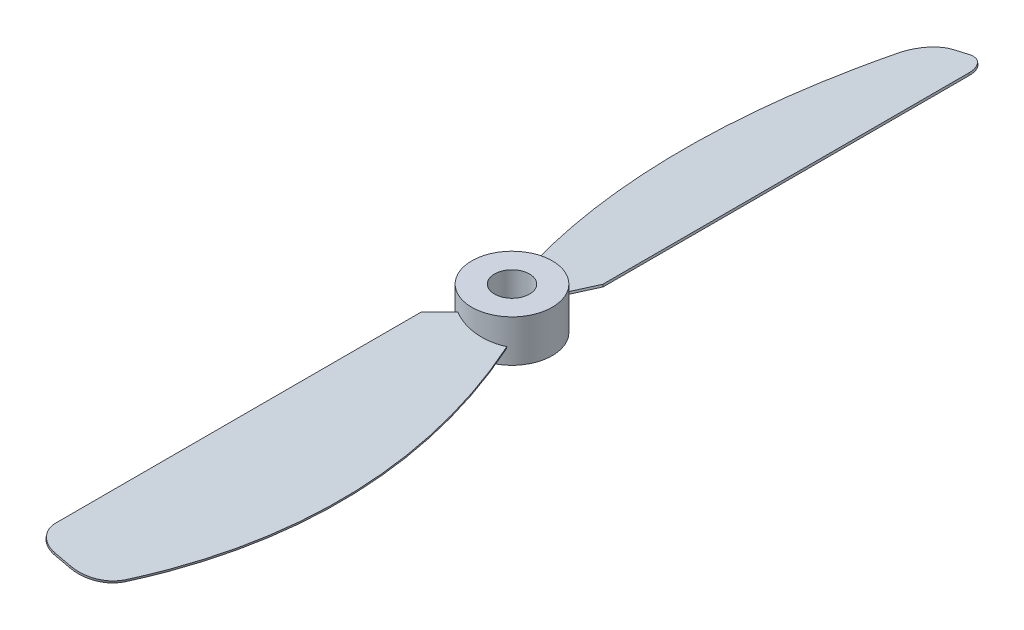
ISO-10303-21;
HEADER;
FILE_DESCRIPTION(('STEP AP214'),'2;1');
FILE_NAME('part.step','',(''),(''),'','','');
FILE_SCHEMA(('AUTOMOTIVE_DESIGN { 1 0 10303 214 1 1 1 1 }'));
ENDSEC;
DATA;
#1=APPLICATION_CONTEXT('core data for automotive mechanical design processes');
#2=APPLICATION_PROTOCOL_DEFINITION('international standard','automotive_design',2000,#1);
#3=PRODUCT_CONTEXT('',#1,'mechanical');
#4=PRODUCT('Part','Part','',(#3));
#5=PRODUCT_RELATED_PRODUCT_CATEGORY('part','',(#4));
#6=PRODUCT_DEFINITION_FORMATION('','',#4);
#7=PRODUCT_DEFINITION_CONTEXT('part definition',#1,'design');
#8=PRODUCT_DEFINITION('design','',#6,#7);
#9=PRODUCT_DEFINITION_SHAPE('','',#8);
#10=(LENGTH_UNIT() NAMED_UNIT(*) SI_UNIT(.MILLI.,.METRE.));
#11=(NAMED_UNIT(*) PLANE_ANGLE_UNIT() SI_UNIT($,.RADIAN.));
#12=(NAMED_UNIT(*) SI_UNIT($,.STERADIAN.) SOLID_ANGLE_UNIT());
#13=UNCERTAINTY_MEASURE_WITH_UNIT(LENGTH_MEASURE(1.E-05),#10,'distance_accuracy_value','');
#14=(GEOMETRIC_REPRESENTATION_CONTEXT(3) GLOBAL_UNCERTAINTY_ASSIGNED_CONTEXT((#13)) GLOBAL_UNIT_ASSIGNED_CONTEXT((#10,
#11,#12)) REPRESENTATION_CONTEXT('',''));
#15=CARTESIAN_POINT('',(0.,0.,0.));
#16=DIRECTION('',(0.,0.,1.));
#17=DIRECTION('',(1.,0.,0.));
#18=AXIS2_PLACEMENT_3D('',#15,#16,#17);
#19=CARTESIAN_POINT('',(0.,3.,0.));
#20=DIRECTION('',(0.,-1.,0.));
#21=DIRECTION('',(0.,0.,-1.));
#22=AXIS2_PLACEMENT_3D('',#19,#20,#21);
#23=CYLINDRICAL_SURFACE('',#22,5.75);
#24=CARTESIAN_POINT('',(0.,-0.153945616169009,0.));
#25=DIRECTION('',(0.224951054343865,0.974370064785235,0.));
#26=DIRECTION('',(0.974370064785235,-0.224951054343865,0.));
#27=AXIS2_PLACEMENT_3D('',#24,#25,#26);
#28=ELLIPSE('',#27,5.901248619812,5.75);
#29=CARTESIAN_POINT('',(-2.69442240653645,0.468110810956249,5.07962477897279));
#30=VERTEX_POINT('',#29);
#31=CARTESIAN_POINT('',(3.63251218425725,-0.992577133390051,4.45728114787732));
#32=VERTEX_POINT('',#31);
#33=EDGE_CURVE('E356',#30,#32,#28,.T.);
#34=ORIENTED_EDGE('',*,*,#33,.F.);
#35=CARTESIAN_POINT('',(0.,-3.75067615816323,0.));
#36=DIRECTION('',(0.796858324367415,-0.183969239930053,0.575475568244139));
#37=DIRECTION('',(-0.149142992703251,-0.982932001086321,-0.107708165744104));
#38=AXIS2_PLACEMENT_3D('',#35,#36,#37);
#39=ELLIPSE('',#38,31.2552250701597,5.75);
#40=CARTESIAN_POINT('',(-2.64477953075084,0.764541082359371,5.10564797393253));
#41=VERTEX_POINT('',#40);
#42=EDGE_CURVE('E229',#41,#30,#39,.T.);
#43=ORIENTED_EDGE('',*,*,#42,.F.);
#44=CARTESIAN_POINT('',(0.,0.153945616169009,0.));
#45=DIRECTION('',(0.224951054343865,0.974370064785235,0.));
#46=DIRECTION('',(0.974370064785235,-0.224951054343865,0.));
#47=AXIS2_PLACEMENT_3D('',#44,#45,#46);
#48=ELLIPSE('',#47,5.901248619812,5.75);
#49=CARTESIAN_POINT('',(3.6832769696305,-0.696405875224031,4.4154241885678));
#50=VERTEX_POINT('',#49);
#51=EDGE_CURVE('E230',#41,#50,#48,.T.);
#52=ORIENTED_EDGE('',*,*,#51,.T.);
#53=CARTESIAN_POINT('',(3.63251218425725,-0.99257713339005,4.45728114787732));
#54=CARTESIAN_POINT('',(3.64100067971846,-0.943211739786049,4.45036346773442));
#55=CARTESIAN_POINT('',(3.64947532623017,-0.893848104803546,4.44341654772051));
#56=CARTESIAN_POINT('',(3.66639692135458,-0.795124352081539,4.42946422795067));
#57=CARTESIAN_POINT('',(3.67484386996729,-0.745764234342035,4.42245882819474));
#58=CARTESIAN_POINT('',(3.68327696963049,-0.696405875224031,4.4154241885678));
#59=B_SPLINE_CURVE_WITH_KNOTS('',3,(#53,#54,#55,#56,#57,#58),.UNSPECIFIED.,.F.,.F.,(4,2,4),(0.,
0.15169584736826,0.303391694736519),.UNSPECIFIED.);
#60=EDGE_CURVE('E221',#32,#50,#59,.T.);
#61=ORIENTED_EDGE('',*,*,#60,.F.);
#62=EDGE_LOOP('',(#34,#43,#52,#61));
#63=FACE_BOUND('',#62,.T.);
#64=CARTESIAN_POINT('',(0.,3.,0.));
#65=DIRECTION('',(0.,1.,0.));
#66=DIRECTION('',(0.,0.,1.));
#67=AXIS2_PLACEMENT_3D('',#64,#65,#66);
#68=CIRCLE('',#67,5.75);
#69=CARTESIAN_POINT('',(0.,3.,5.75));
#70=VERTEX_POINT('',#69);
#71=EDGE_CURVE('E424',#70,#70,#68,.T.);
#72=ORIENTED_EDGE('',*,*,#71,.F.);
#73=EDGE_LOOP('',(#72));
#74=FACE_BOUND('',#73,.T.);
#75=CARTESIAN_POINT('',(0.,-3.,0.));
#76=DIRECTION('',(0.,1.,0.));
#77=DIRECTION('',(0.,0.,1.));
#78=AXIS2_PLACEMENT_3D('',#75,#76,#77);
#79=CIRCLE('',#78,5.75);
#80=CARTESIAN_POINT('',(0.,-3.,5.75));
#81=VERTEX_POINT('',#80);
#82=EDGE_CURVE('E423',#81,#81,#79,.T.);
#83=ORIENTED_EDGE('',*,*,#82,.T.);
#84=EDGE_LOOP('',(#83));
#85=FACE_BOUND('',#84,.T.);
#86=CARTESIAN_POINT('',(0.,-0.153945616169009,0.));
#87=DIRECTION('',(-0.224951054343865,0.974370064785235,0.));
#88=DIRECTION('',(-0.974370064785235,-0.224951054343865,0.));
#89=AXIS2_PLACEMENT_3D('',#86,#87,#88);
#90=ELLIPSE('',#89,5.901248619812,5.75);
#91=CARTESIAN_POINT('',(2.69442240653645,0.468110810956249,-5.07962477897279));
#92=VERTEX_POINT('',#91);
#93=CARTESIAN_POINT('',(-3.63251218425725,-0.992577133390051,-4.45728114787732));
#94=VERTEX_POINT('',#93);
#95=EDGE_CURVE('E345',#92,#94,#90,.T.);
#96=ORIENTED_EDGE('',*,*,#95,.F.);
#97=CARTESIAN_POINT('',(0.,-3.75067615816323,0.));
#98=DIRECTION('',(-0.796858324367415,-0.183969239930053,-0.575475568244139));
#99=DIRECTION('',(0.149142992703251,-0.982932001086321,0.107708165744104));
#100=AXIS2_PLACEMENT_3D('',#97,#98,#99);
#101=ELLIPSE('',#100,31.2552250701597,5.75);
#102=CARTESIAN_POINT('',(2.64477953075084,0.764541082359371,-5.10564797393253));
#103=VERTEX_POINT('',#102);
#104=EDGE_CURVE('E250',#103,#92,#101,.T.);
#105=ORIENTED_EDGE('',*,*,#104,.F.);
#106=CARTESIAN_POINT('',(0.,0.153945616169009,0.));
#107=DIRECTION('',(-0.224951054343865,0.974370064785235,0.));
#108=DIRECTION('',(-0.974370064785235,-0.224951054343865,0.));
#109=AXIS2_PLACEMENT_3D('',#106,#107,#108);
#110=ELLIPSE('',#109,5.901248619812,5.75);
#111=CARTESIAN_POINT('',(-3.6832769696305,-0.696405875224031,-4.4154241885678));
#112=VERTEX_POINT('',#111);
#113=EDGE_CURVE('E251',#103,#112,#110,.T.);
#114=ORIENTED_EDGE('',*,*,#113,.T.);
#115=CARTESIAN_POINT('',(-3.63251218425725,-0.99257713339005,-4.45728114787732));
#116=CARTESIAN_POINT('',(-3.64100067971846,-0.943211739786049,-4.45036346773442));
#117=CARTESIAN_POINT('',(-3.64947532623017,-0.893848104803546,-4.44341654772051));
#118=CARTESIAN_POINT('',(-3.66639692135458,-0.795124352081539,-4.42946422795067));
#119=CARTESIAN_POINT('',(-3.67484386996729,-0.745764234342035,-4.42245882819474));
#120=CARTESIAN_POINT('',(-3.68327696963049,-0.696405875224031,-4.4154241885678));
#121=B_SPLINE_CURVE_WITH_KNOTS('',3,(#115,#116,#117,#118,#119,#120),.UNSPECIFIED.,.F.,.F.,(4,2,
4),(0.,0.15169584736826,0.303391694736519),.UNSPECIFIED.);
#122=EDGE_CURVE('E241',#94,#112,#121,.T.);
#123=ORIENTED_EDGE('',*,*,#122,.F.);
#124=EDGE_LOOP('',(#96,#105,#114,#123));
#125=FACE_BOUND('',#124,.T.);
#126=ADVANCED_FACE('F41',(#63,#74,#85,#125),#23,.T.);
#127=CARTESIAN_POINT('',(0.,3.,0.));
#128=DIRECTION('',(0.,1.,0.));
#129=DIRECTION('',(0.,0.,1.));
#130=AXIS2_PLACEMENT_3D('',#127,#128,#129);
#131=PLANE('',#130);
#132=CARTESIAN_POINT('',(0.,3.,0.));
#133=DIRECTION('',(0.,-1.,0.));
#134=DIRECTION('',(0.,0.,-1.));
#135=AXIS2_PLACEMENT_3D('',#132,#133,#134);
#136=CIRCLE('',#135,2.5);
#137=CARTESIAN_POINT('',(0.,3.,-2.5));
#138=VERTEX_POINT('',#137);
#139=EDGE_CURVE('E284',#138,#138,#136,.T.);
#140=ORIENTED_EDGE('',*,*,#139,.T.);
#141=EDGE_LOOP('',(#140));
#142=FACE_BOUND('',#141,.T.);
#143=ORIENTED_EDGE('',*,*,#71,.T.);
#144=EDGE_LOOP('',(#143));
#145=FACE_BOUND('',#144,.T.);
#146=ADVANCED_FACE('F236',(#142,#145),#131,.T.);
#147=CARTESIAN_POINT('',(0.,-3.,0.));
#148=DIRECTION('',(0.,1.,0.));
#149=DIRECTION('',(0.,0.,1.));
#150=AXIS2_PLACEMENT_3D('',#147,#148,#149);
#151=PLANE('',#150);
#152=CARTESIAN_POINT('',(0.,-3.,0.));
#153=DIRECTION('',(0.,1.,0.));
#154=DIRECTION('',(0.,0.,1.));
#155=AXIS2_PLACEMENT_3D('',#152,#153,#154);
#156=CIRCLE('',#155,3.49999999999999);
#157=CARTESIAN_POINT('',(0.,-3.,3.49999999999999));
#158=VERTEX_POINT('',#157);
#159=EDGE_CURVE('E11',#158,#158,#156,.T.);
#160=ORIENTED_EDGE('',*,*,#159,.T.);
#161=EDGE_LOOP('',(#160));
#162=FACE_BOUND('',#161,.T.);
#163=ORIENTED_EDGE('',*,*,#82,.F.);
#164=EDGE_LOOP('',(#163));
#165=FACE_BOUND('',#164,.T.);
#166=ADVANCED_FACE('F214',(#162,#165),#151,.F.);
#167=CARTESIAN_POINT('',(3.52087999817165,-0.966804812517074,4.17905065683717));
#168=CARTESIAN_POINT('',(10.9244745701346,-2.67605929917321,22.5371504524782));
#169=CARTESIAN_POINT('',(11.2274533946563,-2.74600747233987,41.9175654933242));
#170=CARTESIAN_POINT('',(4.93508001000345,-1.29329861113843,60.1679103138587));
#171=B_SPLINE_CURVE_WITH_KNOTS('',3,(#167,#168,#169,#170),.UNSPECIFIED.,.F.,.F.,(4,4),(0.,
0.942591792092001),.UNSPECIFIED.);
#172=DIRECTION('',(0.224951054343865,0.974370064785235,0.));
#173=VECTOR('',#172,1.);
#174=SURFACE_OF_LINEAR_EXTRUSION('',#171,#173);
#175=CARTESIAN_POINT('',(4.93508001000345,-1.29329861113843,60.1679103138587));
#176=VERTEX_POINT('',#175);
#177=EDGE_CURVE('E196',#32,#176,#171,.T.);
#178=ORIENTED_EDGE('',*,*,#177,.F.);
#179=ORIENTED_EDGE('',*,*,#60,.T.);
#180=CARTESIAN_POINT('',(3.58836531447481,-0.674493793081504,4.17905065683717));
#181=CARTESIAN_POINT('',(10.9919598864378,-2.38374827973764,22.5371504524782));
#182=CARTESIAN_POINT('',(11.2949387109594,-2.4536964529043,41.9175654933242));
#183=CARTESIAN_POINT('',(5.00256532630661,-1.00098759170286,60.1679103138587));
#184=B_SPLINE_CURVE_WITH_KNOTS('',3,(#180,#181,#182,#183),.UNSPECIFIED.,.F.,.F.,(4,4),(0.,
0.942591792092001),.UNSPECIFIED.);
#185=CARTESIAN_POINT('',(5.00256532630661,-1.00098759170286,60.1679103138587));
#186=VERTEX_POINT('',#185);
#187=EDGE_CURVE('E66',#50,#186,#184,.T.);
#188=ORIENTED_EDGE('',*,*,#187,.T.);
#189=DIRECTION('',(0.224951054343865,0.974370064785235,0.));
#190=VECTOR('',#189,1.);
#191=CARTESIAN_POINT('',(4.93508001000345,-1.29329861113843,60.1679103138587));
#192=LINE('',#191,#190);
#193=EDGE_CURVE('E376',#176,#186,#192,.T.);
#194=ORIENTED_EDGE('',*,*,#193,.F.);
#195=EDGE_LOOP('',(#178,#179,#188,#194));
#196=FACE_BOUND('',#195,.T.);
#197=ADVANCED_FACE('F208',(#196),#174,.F.);
#198=CARTESIAN_POINT('',(-1.91210862672236,0.287499443717968,60.5));
#199=DIRECTION('',(0.224951054343865,0.974370064785235,0.));
#200=DIRECTION('',(-0.974370064785235,0.224951054343865,0.));
#201=AXIS2_PLACEMENT_3D('',#198,#199,#200);
#202=CYLINDRICAL_SURFACE('',#201,3.);
#203=CARTESIAN_POINT('',(-1.8446233104192,0.579810463153539,60.5));
#204=DIRECTION('',(-0.224951054343865,-0.974370064785235,0.));
#205=DIRECTION('',(-0.974370064785235,0.224951054343865,0.));
#206=AXIS2_PLACEMENT_3D('',#203,#204,#205);
#207=CIRCLE('',#206,3.);
#208=CARTESIAN_POINT('',(-1.84462331041918,0.579810463153534,63.5));
#209=VERTEX_POINT('',#208);
#210=CARTESIAN_POINT('',(-4.76773350477491,1.25466362618513,60.5));
#211=VERTEX_POINT('',#210);
#212=EDGE_CURVE('E173',#209,#211,#207,.T.);
#213=ORIENTED_EDGE('',*,*,#212,.T.);
#214=DIRECTION('',(0.224951054343865,0.974370064785235,0.));
#215=VECTOR('',#214,1.);
#216=CARTESIAN_POINT('',(-4.83521882107807,0.962352606749564,60.5));
#217=LINE('',#216,#215);
#218=CARTESIAN_POINT('',(-4.83521882107807,0.962352606749564,60.5));
#219=VERTEX_POINT('',#218);
#220=EDGE_CURVE('E419',#219,#211,#217,.T.);
#221=ORIENTED_EDGE('',*,*,#220,.F.);
#222=CARTESIAN_POINT('',(-1.91210862672236,0.287499443717968,60.5));
#223=DIRECTION('',(-0.224951054343865,-0.974370064785235,0.));
#224=DIRECTION('',(-0.974370064785235,0.224951054343865,0.));
#225=AXIS2_PLACEMENT_3D('',#222,#223,#224);
#226=CIRCLE('',#225,3.);
#227=CARTESIAN_POINT('',(-1.91210862672234,0.287499443717963,63.5));
#228=VERTEX_POINT('',#227);
#229=EDGE_CURVE('E184',#228,#219,#226,.T.);
#230=ORIENTED_EDGE('',*,*,#229,.F.);
#231=DIRECTION('',(0.224951054343865,0.974370064785235,0.));
#232=VECTOR('',#231,1.);
#233=CARTESIAN_POINT('',(-1.91210862672234,0.287499443717963,63.5));
#234=LINE('',#233,#232);
#235=EDGE_CURVE('E390',#228,#209,#234,.T.);
#236=ORIENTED_EDGE('',*,*,#235,.T.);
#237=EDGE_LOOP('',(#213,#221,#230,#236));
#238=FACE_BOUND('',#237,.T.);
#239=ADVANCED_FACE('F213',(#238),#202,.T.);
#240=CARTESIAN_POINT('',(-4.83521882107807,0.962352606749564,8.20197580544569));
#241=DIRECTION('',(0.974370064785235,-0.224951054343865,0.));
#242=DIRECTION('',(0.224951054343865,0.974370064785235,0.));
#243=AXIS2_PLACEMENT_3D('',#240,#241,#242);
#244=PLANE('',#243);
#245=DIRECTION('',(0.,0.,-1.));
#246=VECTOR('',#245,1.);
#247=CARTESIAN_POINT('',(-4.76773350477491,1.25466362618513,8.20197580544569));
#248=LINE('',#247,#246);
#249=CARTESIAN_POINT('',(-4.76773350477491,1.25466362618513,8.20197580544569));
#250=VERTEX_POINT('',#249);
#251=EDGE_CURVE('E178',#211,#250,#248,.T.);
#252=ORIENTED_EDGE('',*,*,#251,.T.);
#253=DIRECTION('',(0.224951054343865,0.974370064785235,0.));
#254=VECTOR('',#253,1.);
#255=CARTESIAN_POINT('',(-4.83521882107807,0.962352606749564,8.20197580544569));
#256=LINE('',#255,#254);
#257=CARTESIAN_POINT('',(-4.83521882107807,0.962352606749564,8.20197580544569));
#258=VERTEX_POINT('',#257);
#259=EDGE_CURVE('E416',#258,#250,#256,.T.);
#260=ORIENTED_EDGE('',*,*,#259,.F.);
#261=DIRECTION('',(0.,0.,-1.));
#262=VECTOR('',#261,1.);
#263=CARTESIAN_POINT('',(-4.83521882107807,0.962352606749564,8.20197580544569));
#264=LINE('',#263,#262);
#265=EDGE_CURVE('E188',#219,#258,#264,.T.);
#266=ORIENTED_EDGE('',*,*,#265,.F.);
#267=ORIENTED_EDGE('',*,*,#220,.T.);
#268=EDGE_LOOP('',(#252,#260,#266,#267));
#269=FACE_BOUND('',#268,.T.);
#270=ADVANCED_FACE('F444',(#269),#244,.F.);
#271=CARTESIAN_POINT('',(-2.07695632557669,0.32555753376368,4.17905065683717));
#272=DIRECTION('',(0.796858324367415,-0.183969239930053,0.575475568244139));
#273=DIRECTION('',(0.585468341256702,0.,-0.810695270361266));
#274=AXIS2_PLACEMENT_3D('',#271,#272,#273);
#275=PLANE('',#274);
#276=DIRECTION('',(0.560726166712362,-0.129453835825654,-0.817818971627637));
#277=VECTOR('',#276,1.);
#278=CARTESIAN_POINT('',(-2.00947100927353,0.61786855319925,4.17905065683717));
#279=LINE('',#278,#277);
#280=EDGE_CURVE('E368',#250,#41,#279,.T.);
#281=ORIENTED_EDGE('',*,*,#280,.T.);
#282=ORIENTED_EDGE('',*,*,#42,.T.);
#283=DIRECTION('',(0.560726166712362,-0.129453835825654,-0.817818971627637));
#284=VECTOR('',#283,1.);
#285=CARTESIAN_POINT('',(-2.07695632557669,0.32555753376368,4.17905065683717));
#286=LINE('',#285,#284);
#287=EDGE_CURVE('E192',#258,#30,#286,.T.);
#288=ORIENTED_EDGE('',*,*,#287,.F.);
#289=ORIENTED_EDGE('',*,*,#259,.T.);
#290=EDGE_LOOP('',(#281,#282,#288,#289));
#291=FACE_BOUND('',#290,.T.);
#292=ADVANCED_FACE('F218',(#291),#275,.F.);
#293=CARTESIAN_POINT('',(0.342284081521488,-0.23296812292095,58.5));
#294=DIRECTION('',(0.224951054343865,0.974370064785235,0.));
#295=DIRECTION('',(-0.974370064785235,0.224951054343865,0.));
#296=AXIS2_PLACEMENT_3D('',#293,#294,#295);
#297=CYLINDRICAL_SURFACE('',#296,4.99999999999998);
#298=CARTESIAN_POINT('',(0.409769397824648,0.0593428965146209,58.5));
#299=DIRECTION('',(-0.224951054343865,-0.974370064785235,0.));
#300=DIRECTION('',(-0.974370064785235,0.224951054343865,0.));
#301=AXIS2_PLACEMENT_3D('',#298,#299,#300);
#302=CIRCLE('',#301,4.99999999999998);
#303=CARTESIAN_POINT('',(0.40976939782462,0.0593428965146272,63.5));
#304=VERTEX_POINT('',#303);
#305=EDGE_CURVE('E386',#186,#304,#302,.T.);
#306=ORIENTED_EDGE('',*,*,#305,.T.);
#307=DIRECTION('',(0.224951054343865,0.974370064785235,0.));
#308=VECTOR('',#307,1.);
#309=CARTESIAN_POINT('',(0.342284081521461,-0.232968122920943,63.5));
#310=LINE('',#309,#308);
#311=CARTESIAN_POINT('',(0.342284081521461,-0.232968122920943,63.5));
#312=VERTEX_POINT('',#311);
#313=EDGE_CURVE('E385',#312,#304,#310,.T.);
#314=ORIENTED_EDGE('',*,*,#313,.F.);
#315=CARTESIAN_POINT('',(0.342284081521488,-0.23296812292095,58.5));
#316=DIRECTION('',(-0.224951054343865,-0.974370064785235,0.));
#317=DIRECTION('',(-0.974370064785235,0.224951054343865,0.));
#318=AXIS2_PLACEMENT_3D('',#315,#316,#317);
#319=CIRCLE('',#318,4.99999999999998);
#320=EDGE_CURVE('E202',#176,#312,#319,.T.);
#321=ORIENTED_EDGE('',*,*,#320,.F.);
#322=ORIENTED_EDGE('',*,*,#193,.T.);
#323=EDGE_LOOP('',(#306,#314,#321,#322));
#324=FACE_BOUND('',#323,.T.);
#325=ADVANCED_FACE('F216',(#324),#297,.T.);
#326=CARTESIAN_POINT('',(-1.91210862672234,0.287499443717963,63.5));
#327=DIRECTION('',(0.,0.,-1.));
#328=DIRECTION('',(-1.,0.,0.));
#329=AXIS2_PLACEMENT_3D('',#326,#327,#328);
#330=PLANE('',#329);
#331=DIRECTION('',(-0.974370064785235,0.224951054343865,0.));
#332=VECTOR('',#331,1.);
#333=CARTESIAN_POINT('',(-1.84462331041918,0.579810463153534,63.5));
#334=LINE('',#333,#332);
#335=EDGE_CURVE('E189',#304,#209,#334,.T.);
#336=ORIENTED_EDGE('',*,*,#335,.T.);
#337=ORIENTED_EDGE('',*,*,#235,.F.);
#338=DIRECTION('',(-0.974370064785235,0.224951054343865,0.));
#339=VECTOR('',#338,1.);
#340=CARTESIAN_POINT('',(-1.91210862672234,0.287499443717963,63.5));
#341=LINE('',#340,#339);
#342=EDGE_CURVE('E380',#312,#228,#341,.T.);
#343=ORIENTED_EDGE('',*,*,#342,.F.);
#344=ORIENTED_EDGE('',*,*,#313,.T.);
#345=EDGE_LOOP('',(#336,#337,#343,#344));
#346=FACE_BOUND('',#345,.T.);
#347=ADVANCED_FACE('F392',(#346),#330,.F.);
#348=CARTESIAN_POINT('',(-1.91210862672236,0.287499443717968,60.5));
#349=DIRECTION('',(0.224951054343865,0.974370064785235,0.));
#350=DIRECTION('',(-0.974370064785235,0.224951054343865,0.));
#351=AXIS2_PLACEMENT_3D('',#348,#349,#350);
#352=PLANE('',#351);
#353=ORIENTED_EDGE('',*,*,#287,.T.);
#354=ORIENTED_EDGE('',*,*,#33,.T.);
#355=ORIENTED_EDGE('',*,*,#177,.T.);
#356=ORIENTED_EDGE('',*,*,#320,.T.);
#357=ORIENTED_EDGE('',*,*,#342,.T.);
#358=ORIENTED_EDGE('',*,*,#229,.T.);
#359=ORIENTED_EDGE('',*,*,#265,.T.);
#360=EDGE_LOOP('',(#353,#354,#355,#356,#357,#358,#359));
#361=FACE_BOUND('',#360,.T.);
#362=ADVANCED_FACE('F370',(#361),#352,.F.);
#363=CARTESIAN_POINT('',(-1.8446233104192,0.579810463153539,60.5));
#364=DIRECTION('',(0.224951054343865,0.974370064785235,0.));
#365=DIRECTION('',(-0.974370064785235,0.224951054343865,0.));
#366=AXIS2_PLACEMENT_3D('',#363,#364,#365);
#367=PLANE('',#366);
#368=ORIENTED_EDGE('',*,*,#51,.F.);
#369=ORIENTED_EDGE('',*,*,#280,.F.);
#370=ORIENTED_EDGE('',*,*,#251,.F.);
#371=ORIENTED_EDGE('',*,*,#212,.F.);
#372=ORIENTED_EDGE('',*,*,#335,.F.);
#373=ORIENTED_EDGE('',*,*,#305,.F.);
#374=ORIENTED_EDGE('',*,*,#187,.F.);
#375=EDGE_LOOP('',(#368,#369,#370,#371,#372,#373,#374));
#376=FACE_BOUND('',#375,.T.);
#377=ADVANCED_FACE('F259',(#376),#367,.T.);
#378=CARTESIAN_POINT('',(-3.52087999817165,-0.966804812517074,-4.17905065683717));
#379=CARTESIAN_POINT('',(-10.9244745701346,-2.67605929917321,-22.5371504524782));
#380=CARTESIAN_POINT('',(-11.2274533946563,-2.74600747233987,-41.9175654933242));
#381=CARTESIAN_POINT('',(-4.93508001000345,-1.29329861113843,-60.1679103138587));
#382=B_SPLINE_CURVE_WITH_KNOTS('',3,(#378,#379,#380,#381),.UNSPECIFIED.,.F.,.F.,(4,4),(0.,
0.942591792092001),.UNSPECIFIED.);
#383=DIRECTION('',(-0.224951054343865,0.974370064785235,0.));
#384=VECTOR('',#383,1.);
#385=SURFACE_OF_LINEAR_EXTRUSION('',#382,#384);
#386=CARTESIAN_POINT('',(-4.93508001000345,-1.29329861113843,-60.1679103138587));
#387=VERTEX_POINT('',#386);
#388=EDGE_CURVE('E265',#94,#387,#382,.T.);
#389=ORIENTED_EDGE('',*,*,#388,.F.);
#390=ORIENTED_EDGE('',*,*,#122,.T.);
#391=CARTESIAN_POINT('',(-3.58836531447481,-0.674493793081504,-4.17905065683717));
#392=CARTESIAN_POINT('',(-10.9919598864378,-2.38374827973764,-22.5371504524782));
#393=CARTESIAN_POINT('',(-11.2949387109594,-2.4536964529043,-41.9175654933242));
#394=CARTESIAN_POINT('',(-5.00256532630661,-1.00098759170286,-60.1679103138587));
#395=B_SPLINE_CURVE_WITH_KNOTS('',3,(#391,#392,#393,#394),.UNSPECIFIED.,.F.,.F.,(4,4),(0.,
0.942591792092001),.UNSPECIFIED.);
#396=CARTESIAN_POINT('',(-5.00256532630661,-1.00098759170286,-60.1679103138587));
#397=VERTEX_POINT('',#396);
#398=EDGE_CURVE('E58',#112,#397,#395,.T.);
#399=ORIENTED_EDGE('',*,*,#398,.T.);
#400=DIRECTION('',(-0.224951054343865,0.974370064785235,0.));
#401=VECTOR('',#400,1.);
#402=CARTESIAN_POINT('',(-4.93508001000345,-1.29329861113843,-60.1679103138587));
#403=LINE('',#402,#401);
#404=EDGE_CURVE('E180',#387,#397,#403,.T.);
#405=ORIENTED_EDGE('',*,*,#404,.F.);
#406=EDGE_LOOP('',(#389,#390,#399,#405));
#407=FACE_BOUND('',#406,.T.);
#408=ADVANCED_FACE('F253',(#407),#385,.F.);
#409=CARTESIAN_POINT('',(1.91210862672236,0.287499443717968,-60.5));
#410=DIRECTION('',(-0.224951054343865,0.974370064785235,0.));
#411=DIRECTION('',(-0.974370064785235,-0.224951054343865,0.));
#412=AXIS2_PLACEMENT_3D('',#409,#410,#411);
#413=CYLINDRICAL_SURFACE('',#412,3.);
#414=CARTESIAN_POINT('',(1.8446233104192,0.579810463153539,-60.5));
#415=DIRECTION('',(0.224951054343865,-0.974370064785235,0.));
#416=DIRECTION('',(0.974370064785235,0.224951054343865,0.));
#417=AXIS2_PLACEMENT_3D('',#414,#415,#416);
#418=CIRCLE('',#417,3.);
#419=CARTESIAN_POINT('',(1.84462331041918,0.579810463153534,-63.5));
#420=VERTEX_POINT('',#419);
#421=CARTESIAN_POINT('',(4.76773350477491,1.25466362618513,-60.5));
#422=VERTEX_POINT('',#421);
#423=EDGE_CURVE('E171',#420,#422,#418,.T.);
#424=ORIENTED_EDGE('',*,*,#423,.T.);
#425=DIRECTION('',(-0.224951054343865,0.974370064785235,0.));
#426=VECTOR('',#425,1.);
#427=CARTESIAN_POINT('',(4.83521882107807,0.962352606749564,-60.5));
#428=LINE('',#427,#426);
#429=CARTESIAN_POINT('',(4.83521882107807,0.962352606749564,-60.5));
#430=VERTEX_POINT('',#429);
#431=EDGE_CURVE('E148',#430,#422,#428,.T.);
#432=ORIENTED_EDGE('',*,*,#431,.F.);
#433=CARTESIAN_POINT('',(1.91210862672236,0.287499443717968,-60.5));
#434=DIRECTION('',(0.224951054343865,-0.974370064785235,0.));
#435=DIRECTION('',(0.974370064785235,0.224951054343865,0.));
#436=AXIS2_PLACEMENT_3D('',#433,#434,#435);
#437=CIRCLE('',#436,3.);
#438=CARTESIAN_POINT('',(1.91210862672234,0.287499443717963,-63.5));
#439=VERTEX_POINT('',#438);
#440=EDGE_CURVE('E157',#439,#430,#437,.T.);
#441=ORIENTED_EDGE('',*,*,#440,.F.);
#442=DIRECTION('',(-0.224951054343865,0.974370064785235,0.));
#443=VECTOR('',#442,1.);
#444=CARTESIAN_POINT('',(1.91210862672234,0.287499443717963,-63.5));
#445=LINE('',#444,#443);
#446=EDGE_CURVE('E280',#439,#420,#445,.T.);
#447=ORIENTED_EDGE('',*,*,#446,.T.);
#448=EDGE_LOOP('',(#424,#432,#441,#447));
#449=FACE_BOUND('',#448,.T.);
#450=ADVANCED_FACE('F169',(#449),#413,.T.);
#451=CARTESIAN_POINT('',(4.83521882107807,0.962352606749564,-8.20197580544569));
#452=DIRECTION('',(-0.974370064785235,-0.224951054343865,0.));
#453=DIRECTION('',(0.224951054343865,-0.974370064785235,0.));
#454=AXIS2_PLACEMENT_3D('',#451,#452,#453);
#455=PLANE('',#454);
#456=DIRECTION('',(0.,0.,1.));
#457=VECTOR('',#456,1.);
#458=CARTESIAN_POINT('',(4.76773350477491,1.25466362618513,-8.20197580544569));
#459=LINE('',#458,#457);
#460=CARTESIAN_POINT('',(4.76773350477491,1.25466362618513,-8.20197580544569));
#461=VERTEX_POINT('',#460);
#462=EDGE_CURVE('E283',#422,#461,#459,.T.);
#463=ORIENTED_EDGE('',*,*,#462,.T.);
#464=DIRECTION('',(-0.224951054343865,0.974370064785235,0.));
#465=VECTOR('',#464,1.);
#466=CARTESIAN_POINT('',(4.83521882107807,0.962352606749564,-8.20197580544569));
#467=LINE('',#466,#465);
#468=CARTESIAN_POINT('',(4.83521882107807,0.962352606749564,-8.20197580544569));
#469=VERTEX_POINT('',#468);
#470=EDGE_CURVE('E151',#469,#461,#467,.T.);
#471=ORIENTED_EDGE('',*,*,#470,.F.);
#472=DIRECTION('',(0.,0.,1.));
#473=VECTOR('',#472,1.);
#474=CARTESIAN_POINT('',(4.83521882107807,0.962352606749564,-8.20197580544569));
#475=LINE('',#474,#473);
#476=EDGE_CURVE('E144',#430,#469,#475,.T.);
#477=ORIENTED_EDGE('',*,*,#476,.F.);
#478=ORIENTED_EDGE('',*,*,#431,.T.);
#479=EDGE_LOOP('',(#463,#471,#477,#478));
#480=FACE_BOUND('',#479,.T.);
#481=ADVANCED_FACE('F146',(#480),#455,.F.);
#482=CARTESIAN_POINT('',(2.07695632557669,0.32555753376368,-4.17905065683717));
#483=DIRECTION('',(-0.796858324367415,-0.183969239930053,-0.575475568244139));
#484=DIRECTION('',(-0.585468341256702,0.,0.810695270361266));
#485=AXIS2_PLACEMENT_3D('',#482,#483,#484);
#486=PLANE('',#485);
#487=DIRECTION('',(-0.560726166712362,-0.129453835825654,0.817818971627637));
#488=VECTOR('',#487,1.);
#489=CARTESIAN_POINT('',(2.00947100927353,0.61786855319925,-4.17905065683717));
#490=LINE('',#489,#488);
#491=EDGE_CURVE('E287',#461,#103,#490,.T.);
#492=ORIENTED_EDGE('',*,*,#491,.T.);
#493=ORIENTED_EDGE('',*,*,#104,.T.);
#494=DIRECTION('',(-0.560726166712362,-0.129453835825654,0.817818971627637));
#495=VECTOR('',#494,1.);
#496=CARTESIAN_POINT('',(2.07695632557669,0.32555753376368,-4.17905065683717));
#497=LINE('',#496,#495);
#498=EDGE_CURVE('E156',#469,#92,#497,.T.);
#499=ORIENTED_EDGE('',*,*,#498,.F.);
#500=ORIENTED_EDGE('',*,*,#470,.T.);
#501=EDGE_LOOP('',(#492,#493,#499,#500));
#502=FACE_BOUND('',#501,.T.);
#503=ADVANCED_FACE('F263',(#502),#486,.F.);
#504=CARTESIAN_POINT('',(-0.342284081521488,-0.23296812292095,-58.5));
#505=DIRECTION('',(-0.224951054343865,0.974370064785235,0.));
#506=DIRECTION('',(-0.974370064785235,-0.224951054343865,0.));
#507=AXIS2_PLACEMENT_3D('',#504,#505,#506);
#508=CYLINDRICAL_SURFACE('',#507,4.99999999999998);
#509=CARTESIAN_POINT('',(-0.409769397824648,0.0593428965146209,-58.5));
#510=DIRECTION('',(0.224951054343865,-0.974370064785235,0.));
#511=DIRECTION('',(0.974370064785235,0.224951054343865,0.));
#512=AXIS2_PLACEMENT_3D('',#509,#510,#511);
#513=CIRCLE('',#512,4.99999999999998);
#514=CARTESIAN_POINT('',(-0.40976939782462,0.0593428965146272,-63.5));
#515=VERTEX_POINT('',#514);
#516=EDGE_CURVE('E295',#397,#515,#513,.T.);
#517=ORIENTED_EDGE('',*,*,#516,.T.);
#518=DIRECTION('',(-0.224951054343865,0.974370064785235,0.));
#519=VECTOR('',#518,1.);
#520=CARTESIAN_POINT('',(-0.342284081521461,-0.232968122920943,-63.5));
#521=LINE('',#520,#519);
#522=CARTESIAN_POINT('',(-0.342284081521461,-0.232968122920943,-63.5));
#523=VERTEX_POINT('',#522);
#524=EDGE_CURVE('E305',#523,#515,#521,.T.);
#525=ORIENTED_EDGE('',*,*,#524,.F.);
#526=CARTESIAN_POINT('',(-0.342284081521488,-0.23296812292095,-58.5));
#527=DIRECTION('',(0.224951054343865,-0.974370064785235,0.));
#528=DIRECTION('',(0.974370064785235,0.224951054343865,0.));
#529=AXIS2_PLACEMENT_3D('',#526,#527,#528);
#530=CIRCLE('',#529,4.99999999999998);
#531=EDGE_CURVE('E272',#387,#523,#530,.T.);
#532=ORIENTED_EDGE('',*,*,#531,.F.);
#533=ORIENTED_EDGE('',*,*,#404,.T.);
#534=EDGE_LOOP('',(#517,#525,#532,#533));
#535=FACE_BOUND('',#534,.T.);
#536=ADVANCED_FACE('F261',(#535),#508,.T.);
#537=CARTESIAN_POINT('',(1.91210862672234,0.287499443717963,-63.5));
#538=DIRECTION('',(0.,0.,1.));
#539=DIRECTION('',(1.,0.,0.));
#540=AXIS2_PLACEMENT_3D('',#537,#538,#539);
#541=PLANE('',#540);
#542=DIRECTION('',(0.974370064785235,0.224951054343865,0.));
#543=VECTOR('',#542,1.);
#544=CARTESIAN_POINT('',(1.84462331041918,0.579810463153534,-63.5));
#545=LINE('',#544,#543);
#546=EDGE_CURVE('E167',#515,#420,#545,.T.);
#547=ORIENTED_EDGE('',*,*,#546,.T.);
#548=ORIENTED_EDGE('',*,*,#446,.F.);
#549=DIRECTION('',(0.974370064785235,0.224951054343865,0.));
#550=VECTOR('',#549,1.);
#551=CARTESIAN_POINT('',(1.91210862672234,0.287499443717963,-63.5));
#552=LINE('',#551,#550);
#553=EDGE_CURVE('E162',#523,#439,#552,.T.);
#554=ORIENTED_EDGE('',*,*,#553,.F.);
#555=ORIENTED_EDGE('',*,*,#524,.T.);
#556=EDGE_LOOP('',(#547,#548,#554,#555));
#557=FACE_BOUND('',#556,.T.);
#558=ADVANCED_FACE('F318',(#557),#541,.F.);
#559=CARTESIAN_POINT('',(1.91210862672236,0.287499443717968,-60.5));
#560=DIRECTION('',(-0.224951054343865,0.974370064785235,0.));
#561=DIRECTION('',(0.974370064785235,0.224951054343865,0.));
#562=AXIS2_PLACEMENT_3D('',#559,#560,#561);
#563=PLANE('',#562);
#564=ORIENTED_EDGE('',*,*,#498,.T.);
#565=ORIENTED_EDGE('',*,*,#95,.T.);
#566=ORIENTED_EDGE('',*,*,#388,.T.);
#567=ORIENTED_EDGE('',*,*,#531,.T.);
#568=ORIENTED_EDGE('',*,*,#553,.T.);
#569=ORIENTED_EDGE('',*,*,#440,.T.);
#570=ORIENTED_EDGE('',*,*,#476,.T.);
#571=EDGE_LOOP('',(#564,#565,#566,#567,#568,#569,#570));
#572=FACE_BOUND('',#571,.T.);
#573=ADVANCED_FACE('F160',(#572),#563,.F.);
#574=CARTESIAN_POINT('',(1.8446233104192,0.579810463153539,-60.5));
#575=DIRECTION('',(-0.224951054343865,0.974370064785235,0.));
#576=DIRECTION('',(0.974370064785235,0.224951054343865,0.));
#577=AXIS2_PLACEMENT_3D('',#574,#575,#576);
#578=PLANE('',#577);
#579=ORIENTED_EDGE('',*,*,#113,.F.);
#580=ORIENTED_EDGE('',*,*,#491,.F.);
#581=ORIENTED_EDGE('',*,*,#462,.F.);
#582=ORIENTED_EDGE('',*,*,#423,.F.);
#583=ORIENTED_EDGE('',*,*,#546,.F.);
#584=ORIENTED_EDGE('',*,*,#516,.F.);
#585=ORIENTED_EDGE('',*,*,#398,.F.);
#586=EDGE_LOOP('',(#579,#580,#581,#582,#583,#584,#585));
#587=FACE_BOUND('',#586,.T.);
#588=ADVANCED_FACE('F316',(#587),#578,.T.);
#589=CARTESIAN_POINT('',(0.,3.,0.));
#590=DIRECTION('',(0.,-1.,0.));
#591=DIRECTION('',(0.,0.,-1.));
#592=AXIS2_PLACEMENT_3D('',#589,#590,#591);
#593=CYLINDRICAL_SURFACE('',#592,2.5);
#594=CARTESIAN_POINT('',(0.,-2.00000000000002,0.));
#595=DIRECTION('',(0.,1.,0.));
#596=DIRECTION('',(0.,0.,1.));
#597=AXIS2_PLACEMENT_3D('',#594,#595,#596);
#598=CIRCLE('',#597,2.5);
#599=CARTESIAN_POINT('',(0.,-2.00000000000002,2.5));
#600=VERTEX_POINT('',#599);
#601=EDGE_CURVE('E51',#600,#600,#598,.F.);
#602=ORIENTED_EDGE('',*,*,#601,.T.);
#603=EDGE_LOOP('',(#602));
#604=FACE_BOUND('',#603,.T.);
#605=ORIENTED_EDGE('',*,*,#139,.F.);
#606=EDGE_LOOP('',(#605));
#607=FACE_BOUND('',#606,.T.);
#608=ADVANCED_FACE('F327',(#604,#607),#593,.F.);
#609=CARTESIAN_POINT('',(0.,-2.00000000000002,0.));
#610=DIRECTION('',(0.,-1.,0.));
#611=DIRECTION('',(0.,0.,-1.));
#612=AXIS2_PLACEMENT_3D('',#609,#610,#611);
#613=CONICAL_SURFACE('',#612,2.5,0.785398163397451);
#614=ORIENTED_EDGE('',*,*,#159,.F.);
#615=EDGE_LOOP('',(#614));
#616=FACE_BOUND('',#615,.T.);
#617=ORIENTED_EDGE('',*,*,#601,.F.);
#618=EDGE_LOOP('',(#617));
#619=FACE_BOUND('',#618,.T.);
#620=ADVANCED_FACE('F44',(#616,#619),#613,.F.);
#621=CLOSED_SHELL('',(#126,#146,#166,#197,#239,#270,#292,#325,#347,#362,#377,#408,#450,#481,
#503,#536,#558,#573,#588,#608,#620));
#622=MANIFOLD_SOLID_BREP('B2',#621);
#623=ADVANCED_BREP_SHAPE_REPRESENTATION('',(#18,#622),#14);
#624=SHAPE_DEFINITION_REPRESENTATION(#9,#623);
ENDSEC;
END-ISO-10303-21;
